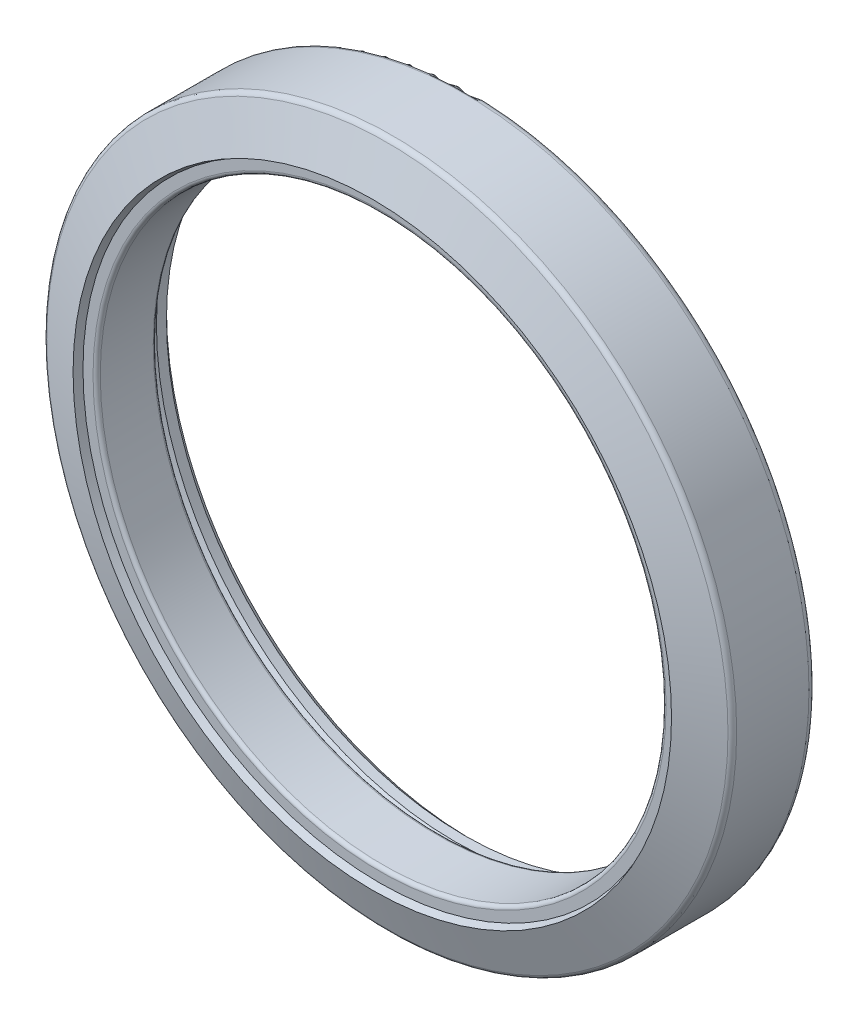
ISO-10303-21;
HEADER;
FILE_DESCRIPTION(('STEP AP214'),'2;1');
FILE_NAME('part.step','',(''),(''),'','','');
FILE_SCHEMA(('AUTOMOTIVE_DESIGN { 1 0 10303 214 1 1 1 1 }'));
ENDSEC;
DATA;
#1=APPLICATION_CONTEXT('core data for automotive mechanical design processes');
#2=APPLICATION_PROTOCOL_DEFINITION('international standard','automotive_design',2000,#1);
#3=PRODUCT_CONTEXT('',#1,'mechanical');
#4=PRODUCT('Part','Part','',(#3));
#5=PRODUCT_RELATED_PRODUCT_CATEGORY('part','',(#4));
#6=PRODUCT_DEFINITION_FORMATION('','',#4);
#7=PRODUCT_DEFINITION_CONTEXT('part definition',#1,'design');
#8=PRODUCT_DEFINITION('design','',#6,#7);
#9=PRODUCT_DEFINITION_SHAPE('','',#8);
#10=(LENGTH_UNIT() NAMED_UNIT(*) SI_UNIT(.MILLI.,.METRE.));
#11=(NAMED_UNIT(*) PLANE_ANGLE_UNIT() SI_UNIT($,.RADIAN.));
#12=(NAMED_UNIT(*) SI_UNIT($,.STERADIAN.) SOLID_ANGLE_UNIT());
#13=UNCERTAINTY_MEASURE_WITH_UNIT(LENGTH_MEASURE(1.E-05),#10,'distance_accuracy_value','');
#14=(GEOMETRIC_REPRESENTATION_CONTEXT(3) GLOBAL_UNCERTAINTY_ASSIGNED_CONTEXT((#13)) GLOBAL_UNIT_ASSIGNED_CONTEXT((#10,
#11,#12)) REPRESENTATION_CONTEXT('',''));
#15=CARTESIAN_POINT('',(0.,0.,0.));
#16=DIRECTION('',(0.,0.,1.));
#17=DIRECTION('',(1.,0.,0.));
#18=AXIS2_PLACEMENT_3D('',#15,#16,#17);
#19=CARTESIAN_POINT('',(0.,0.,-3.4925));
#20=DIRECTION('',(0.,0.,-1.));
#21=DIRECTION('',(-1.,0.,0.));
#22=AXIS2_PLACEMENT_3D('',#19,#20,#21);
#23=CONICAL_SURFACE('',#22,21.3995,0.78539816339745);
#24=CARTESIAN_POINT('',(0.,0.,-2.9845));
#25=DIRECTION('',(0.,0.,-1.));
#26=DIRECTION('',(-1.,0.,0.));
#27=AXIS2_PLACEMENT_3D('',#24,#25,#26);
#28=CIRCLE('',#27,20.8915);
#29=CARTESIAN_POINT('',(-20.8915,0.,-2.9845));
#30=VERTEX_POINT('',#29);
#31=EDGE_CURVE('E107',#30,#30,#28,.T.);
#32=ORIENTED_EDGE('',*,*,#31,.F.);
#33=EDGE_LOOP('',(#32));
#34=FACE_BOUND('',#33,.T.);
#35=CARTESIAN_POINT('',(0.,0.,-3.4925));
#36=DIRECTION('',(0.,0.,1.));
#37=DIRECTION('',(-1.,0.,0.));
#38=AXIS2_PLACEMENT_3D('',#35,#36,#37);
#39=CIRCLE('',#38,21.3995);
#40=CARTESIAN_POINT('',(-21.3995,0.,-3.4925));
#41=VERTEX_POINT('',#40);
#42=EDGE_CURVE('E122',#41,#41,#39,.T.);
#43=ORIENTED_EDGE('',*,*,#42,.F.);
#44=EDGE_LOOP('',(#43));
#45=FACE_BOUND('',#44,.T.);
#46=ADVANCED_FACE('F16',(#34,#45),#23,.F.);
#47=CARTESIAN_POINT('',(0.,0.,3.4925));
#48=DIRECTION('',(0.,0.,1.));
#49=DIRECTION('',(0.,-1.,0.));
#50=AXIS2_PLACEMENT_3D('',#47,#48,#49);
#51=CYLINDRICAL_SURFACE('',#50,19.812);
#52=CARTESIAN_POINT('',(0.,0.,-0.9779));
#53=DIRECTION('',(0.,0.,-1.));
#54=DIRECTION('',(1.,0.,0.));
#55=AXIS2_PLACEMENT_3D('',#52,#53,#54);
#56=CIRCLE('',#55,19.812);
#57=CARTESIAN_POINT('',(19.812,0.,-0.9779));
#58=VERTEX_POINT('',#57);
#59=EDGE_CURVE('E115',#58,#58,#56,.T.);
#60=ORIENTED_EDGE('',*,*,#59,.T.);
#61=EDGE_LOOP('',(#60));
#62=FACE_BOUND('',#61,.T.);
#63=CARTESIAN_POINT('',(0.,0.,2.73049999999994));
#64=DIRECTION('',(0.,0.,1.));
#65=DIRECTION('',(-1.,0.,0.));
#66=AXIS2_PLACEMENT_3D('',#63,#64,#65);
#67=CIRCLE('',#66,19.812);
#68=CARTESIAN_POINT('',(-19.812,0.,2.73049999999994));
#69=VERTEX_POINT('',#68);
#70=EDGE_CURVE('E111',#69,#69,#67,.T.);
#71=ORIENTED_EDGE('',*,*,#70,.T.);
#72=EDGE_LOOP('',(#71));
#73=FACE_BOUND('',#72,.T.);
#74=ADVANCED_FACE('F18',(#62,#73),#51,.F.);
#75=CARTESIAN_POINT('',(0.,0.,2.33689450620482));
#76=DIRECTION('',(0.,0.,-1.));
#77=DIRECTION('',(-1.,0.,0.));
#78=AXIS2_PLACEMENT_3D('',#75,#76,#77);
#79=CONICAL_SURFACE('',#78,24.13,1.22173047639603);
#80=CARTESIAN_POINT('',(0.,0.,3.4925));
#81=DIRECTION('',(0.,0.,1.));
#82=DIRECTION('',(1.,0.,0.));
#83=AXIS2_PLACEMENT_3D('',#80,#81,#82);
#84=CIRCLE('',#83,20.955);
#85=CARTESIAN_POINT('',(20.955,0.,3.4925));
#86=VERTEX_POINT('',#85);
#87=EDGE_CURVE('E25',#86,#86,#84,.T.);
#88=ORIENTED_EDGE('',*,*,#87,.F.);
#89=EDGE_LOOP('',(#88));
#90=FACE_BOUND('',#89,.T.);
#91=CARTESIAN_POINT('',(0.,0.,2.43738316661672));
#92=DIRECTION('',(0.,0.,1.));
#93=DIRECTION('',(-1.,0.,0.));
#94=AXIS2_PLACEMENT_3D('',#91,#92,#93);
#95=CIRCLE('',#94,23.8539096746071);
#96=CARTESIAN_POINT('',(-23.8539096746071,0.,2.43738316661672));
#97=VERTEX_POINT('',#96);
#98=EDGE_CURVE('E119',#97,#97,#95,.T.);
#99=ORIENTED_EDGE('',*,*,#98,.T.);
#100=EDGE_LOOP('',(#99));
#101=FACE_BOUND('',#100,.T.);
#102=ADVANCED_FACE('F155',(#90,#101),#79,.T.);
#103=CARTESIAN_POINT('',(0.,0.,2.98449999999994));
#104=DIRECTION('',(0.,0.,-1.));
#105=DIRECTION('',(0.,-1.,0.));
#106=AXIS2_PLACEMENT_3D('',#103,#104,#105);
#107=PLANE('',#106);
#108=CARTESIAN_POINT('',(0.,0.,2.98449999999994));
#109=DIRECTION('',(0.,0.,-1.));
#110=DIRECTION('',(-1.,0.,0.));
#111=AXIS2_PLACEMENT_3D('',#108,#109,#110);
#112=CIRCLE('',#111,20.066);
#113=CARTESIAN_POINT('',(-20.066,0.,2.98449999999994));
#114=VERTEX_POINT('',#113);
#115=EDGE_CURVE('E114',#114,#114,#112,.T.);
#116=ORIENTED_EDGE('',*,*,#115,.T.);
#117=EDGE_LOOP('',(#116));
#118=FACE_BOUND('',#117,.T.);
#119=CARTESIAN_POINT('',(0.,0.,2.98449999999994));
#120=DIRECTION('',(0.,0.,1.));
#121=DIRECTION('',(1.,0.,0.));
#122=AXIS2_PLACEMENT_3D('',#119,#120,#121);
#123=CIRCLE('',#122,20.7701031209927);
#124=CARTESIAN_POINT('',(20.7701031209927,0.,2.98449999999994));
#125=VERTEX_POINT('',#124);
#126=EDGE_CURVE('E11',#125,#125,#123,.T.);
#127=ORIENTED_EDGE('',*,*,#126,.T.);
#128=EDGE_LOOP('',(#127));
#129=FACE_BOUND('',#128,.T.);
#130=ADVANCED_FACE('F159',(#118,#129),#107,.F.);
#131=CARTESIAN_POINT('',(0.,0.,3.4925));
#132=DIRECTION('',(0.,0.,1.));
#133=DIRECTION('',(1.,0.,0.));
#134=AXIS2_PLACEMENT_3D('',#131,#132,#133);
#135=CONICAL_SURFACE('',#134,20.955,0.349065850398865);
#136=ORIENTED_EDGE('',*,*,#126,.F.);
#137=EDGE_LOOP('',(#136));
#138=FACE_BOUND('',#137,.T.);
#139=ORIENTED_EDGE('',*,*,#87,.T.);
#140=EDGE_LOOP('',(#139));
#141=FACE_BOUND('',#140,.T.);
#142=ADVANCED_FACE('F202',(#138,#141),#135,.F.);
#143=CARTESIAN_POINT('',(0.,0.,2.07936027809728));
#144=DIRECTION('',(0.,0.,-1.));
#145=DIRECTION('',(-1.,0.,0.));
#146=AXIS2_PLACEMENT_3D('',#143,#144,#145);
#147=TOROIDAL_SURFACE('',#146,23.7236,0.381);
#148=CARTESIAN_POINT('',(0.,0.,2.07936027809728));
#149=DIRECTION('',(0.,0.,-1.));
#150=DIRECTION('',(-1.,0.,0.));
#151=AXIS2_PLACEMENT_3D('',#148,#149,#150);
#152=CIRCLE('',#151,24.1046);
#153=CARTESIAN_POINT('',(-24.1046,0.,2.07936027809728));
#154=VERTEX_POINT('',#153);
#155=EDGE_CURVE('E100',#154,#154,#152,.T.);
#156=ORIENTED_EDGE('',*,*,#155,.F.);
#157=EDGE_LOOP('',(#156));
#158=FACE_BOUND('',#157,.T.);
#159=ORIENTED_EDGE('',*,*,#98,.F.);
#160=EDGE_LOOP('',(#159));
#161=FACE_BOUND('',#160,.T.);
#162=ADVANCED_FACE('F198',(#158,#161),#147,.T.);
#163=CARTESIAN_POINT('',(0.,0.,-2.9845));
#164=DIRECTION('',(0.,0.,-1.));
#165=DIRECTION('',(-1.,0.,0.));
#166=AXIS2_PLACEMENT_3D('',#163,#164,#165);
#167=TOROIDAL_SURFACE('',#166,23.5966,0.508);
#168=CARTESIAN_POINT('',(0.,0.,-2.9845));
#169=DIRECTION('',(0.,0.,1.));
#170=DIRECTION('',(-1.,0.,0.));
#171=AXIS2_PLACEMENT_3D('',#168,#169,#170);
#172=CIRCLE('',#171,24.1046);
#173=CARTESIAN_POINT('',(-24.1046,0.,-2.9845));
#174=VERTEX_POINT('',#173);
#175=EDGE_CURVE('E94',#174,#174,#172,.T.);
#176=ORIENTED_EDGE('',*,*,#175,.F.);
#177=EDGE_LOOP('',(#176));
#178=FACE_BOUND('',#177,.T.);
#179=CARTESIAN_POINT('',(0.,0.,-3.4925));
#180=DIRECTION('',(0.,0.,-1.));
#181=DIRECTION('',(-1.,0.,0.));
#182=AXIS2_PLACEMENT_3D('',#179,#180,#181);
#183=CIRCLE('',#182,23.5966);
#184=CARTESIAN_POINT('',(-23.5966,0.,-3.4925));
#185=VERTEX_POINT('',#184);
#186=EDGE_CURVE('E125',#185,#185,#183,.T.);
#187=ORIENTED_EDGE('',*,*,#186,.F.);
#188=EDGE_LOOP('',(#187));
#189=FACE_BOUND('',#188,.T.);
#190=ADVANCED_FACE('F185',(#178,#189),#167,.T.);
#191=CARTESIAN_POINT('',(0.,0.,-3.4925));
#192=DIRECTION('',(0.,0.,-1.));
#193=DIRECTION('',(0.,-1.,0.));
#194=AXIS2_PLACEMENT_3D('',#191,#192,#193);
#195=PLANE('',#194);
#196=ORIENTED_EDGE('',*,*,#42,.T.);
#197=EDGE_LOOP('',(#196));
#198=FACE_BOUND('',#197,.T.);
#199=ORIENTED_EDGE('',*,*,#186,.T.);
#200=EDGE_LOOP('',(#199));
#201=FACE_BOUND('',#200,.T.);
#202=ADVANCED_FACE('F180',(#198,#201),#195,.T.);
#203=CARTESIAN_POINT('',(0.,0.,2.73049999999994));
#204=DIRECTION('',(0.,0.,-1.));
#205=DIRECTION('',(-1.,0.,0.));
#206=AXIS2_PLACEMENT_3D('',#203,#204,#205);
#207=TOROIDAL_SURFACE('',#206,20.066,0.254);
#208=ORIENTED_EDGE('',*,*,#115,.F.);
#209=EDGE_LOOP('',(#208));
#210=FACE_BOUND('',#209,.T.);
#211=ORIENTED_EDGE('',*,*,#70,.F.);
#212=EDGE_LOOP('',(#211));
#213=FACE_BOUND('',#212,.T.);
#214=ADVANCED_FACE('F184',(#210,#213),#207,.T.);
#215=CARTESIAN_POINT('',(0.,0.,-0.9779));
#216=DIRECTION('',(0.,0.,1.));
#217=DIRECTION('',(1.,0.,0.));
#218=AXIS2_PLACEMENT_3D('',#215,#216,#217);
#219=TOROIDAL_SURFACE('',#218,20.0152,0.2032);
#220=CARTESIAN_POINT('',(0.,0.,-1.1811));
#221=DIRECTION('',(0.,0.,1.));
#222=DIRECTION('',(1.,0.,0.));
#223=AXIS2_PLACEMENT_3D('',#220,#221,#222);
#224=CIRCLE('',#223,20.0152);
#225=CARTESIAN_POINT('',(20.0152,0.,-1.1811));
#226=VERTEX_POINT('',#225);
#227=EDGE_CURVE('E116',#226,#226,#224,.T.);
#228=ORIENTED_EDGE('',*,*,#227,.F.);
#229=EDGE_LOOP('',(#228));
#230=FACE_BOUND('',#229,.T.);
#231=ORIENTED_EDGE('',*,*,#59,.F.);
#232=EDGE_LOOP('',(#231));
#233=FACE_BOUND('',#232,.T.);
#234=ADVANCED_FACE('F193',(#230,#233),#219,.T.);
#235=CARTESIAN_POINT('',(0.,0.,-1.1811));
#236=DIRECTION('',(0.,0.,1.));
#237=DIRECTION('',(1.,0.,0.));
#238=AXIS2_PLACEMENT_3D('',#235,#236,#237);
#239=PLANE('',#238);
#240=ORIENTED_EDGE('',*,*,#227,.T.);
#241=EDGE_LOOP('',(#240));
#242=FACE_BOUND('',#241,.T.);
#243=CARTESIAN_POINT('',(0.,0.,-1.1811));
#244=DIRECTION('',(0.,0.,-1.));
#245=DIRECTION('',(0.,1.,0.));
#246=AXIS2_PLACEMENT_3D('',#243,#244,#245);
#247=CIRCLE('',#246,20.8915);
#248=CARTESIAN_POINT('',(0.,20.8915,-1.1811));
#249=VERTEX_POINT('',#248);
#250=EDGE_CURVE('E105',#249,#249,#247,.T.);
#251=ORIENTED_EDGE('',*,*,#250,.T.);
#252=EDGE_LOOP('',(#251));
#253=FACE_BOUND('',#252,.T.);
#254=ADVANCED_FACE('F175',(#242,#253),#239,.F.);
#255=CARTESIAN_POINT('',(0.,0.,-1.5621));
#256=DIRECTION('',(0.,0.,1.));
#257=DIRECTION('',(1.,0.,0.));
#258=AXIS2_PLACEMENT_3D('',#255,#256,#257);
#259=TOROIDAL_SURFACE('',#258,20.8915,0.381);
#260=ORIENTED_EDGE('',*,*,#250,.F.);
#261=EDGE_LOOP('',(#260));
#262=FACE_BOUND('',#261,.T.);
#263=CARTESIAN_POINT('',(0.,0.,-1.76399923967285));
#264=DIRECTION('',(0.,0.,1.));
#265=DIRECTION('',(1.,0.,0.));
#266=AXIS2_PLACEMENT_3D('',#263,#264,#265);
#267=CIRCLE('',#266,21.2146063246356);
#268=CARTESIAN_POINT('',(21.2146063246356,0.,-1.76399923967285));
#269=VERTEX_POINT('',#268);
#270=EDGE_CURVE('E99',#269,#269,#267,.T.);
#271=ORIENTED_EDGE('',*,*,#270,.F.);
#272=EDGE_LOOP('',(#271));
#273=FACE_BOUND('',#272,.T.);
#274=ADVANCED_FACE('F167',(#262,#273),#259,.F.);
#275=CARTESIAN_POINT('',(0.,0.,-2.28107744753876));
#276=DIRECTION('',(0.,0.,1.));
#277=DIRECTION('',(1.,0.,0.));
#278=AXIS2_PLACEMENT_3D('',#275,#276,#277);
#279=CONICAL_SURFACE('',#278,20.8915,0.558505360638186);
#280=CARTESIAN_POINT('',(0.,0.,-2.28107744753876));
#281=DIRECTION('',(0.,0.,1.));
#282=DIRECTION('',(1.,0.,0.));
#283=AXIS2_PLACEMENT_3D('',#280,#281,#282);
#284=CIRCLE('',#283,20.8915);
#285=CARTESIAN_POINT('',(20.8915,0.,-2.28107744753876));
#286=VERTEX_POINT('',#285);
#287=EDGE_CURVE('E297',#286,#286,#284,.T.);
#288=ORIENTED_EDGE('',*,*,#287,.F.);
#289=EDGE_LOOP('',(#288));
#290=FACE_BOUND('',#289,.T.);
#291=ORIENTED_EDGE('',*,*,#270,.T.);
#292=EDGE_LOOP('',(#291));
#293=FACE_BOUND('',#292,.T.);
#294=ADVANCED_FACE('F151',(#290,#293),#279,.F.);
#295=CARTESIAN_POINT('',(0.,0.,3.4925));
#296=DIRECTION('',(0.,0.,1.));
#297=DIRECTION('',(-1.,0.,0.));
#298=AXIS2_PLACEMENT_3D('',#295,#296,#297);
#299=CYLINDRICAL_SURFACE('',#298,24.1046);
#300=ORIENTED_EDGE('',*,*,#175,.T.);
#301=EDGE_LOOP('',(#300));
#302=FACE_BOUND('',#301,.T.);
#303=ORIENTED_EDGE('',*,*,#155,.T.);
#304=EDGE_LOOP('',(#303));
#305=FACE_BOUND('',#304,.T.);
#306=ADVANCED_FACE('F95',(#302,#305),#299,.T.);
#307=CARTESIAN_POINT('',(0.,0.,-3.4925));
#308=DIRECTION('',(0.,0.,-1.));
#309=DIRECTION('',(0.,1.,0.));
#310=AXIS2_PLACEMENT_3D('',#307,#308,#309);
#311=CYLINDRICAL_SURFACE('',#310,20.8915);
#312=ORIENTED_EDGE('',*,*,#31,.T.);
#313=EDGE_LOOP('',(#312));
#314=FACE_BOUND('',#313,.T.);
#315=ORIENTED_EDGE('',*,*,#287,.T.);
#316=EDGE_LOOP('',(#315));
#317=FACE_BOUND('',#316,.T.);
#318=ADVANCED_FACE('F138',(#314,#317),#311,.F.);
#319=CLOSED_SHELL('',(#46,#74,#102,#130,#142,#162,#190,#202,#214,#234,#254,#274,#294,#306,#318));
#320=MANIFOLD_SOLID_BREP('B1',#319);
#321=ADVANCED_BREP_SHAPE_REPRESENTATION('',(#18,#320),#14);
#322=SHAPE_DEFINITION_REPRESENTATION(#9,#321);
ENDSEC;
END-ISO-10303-21;
